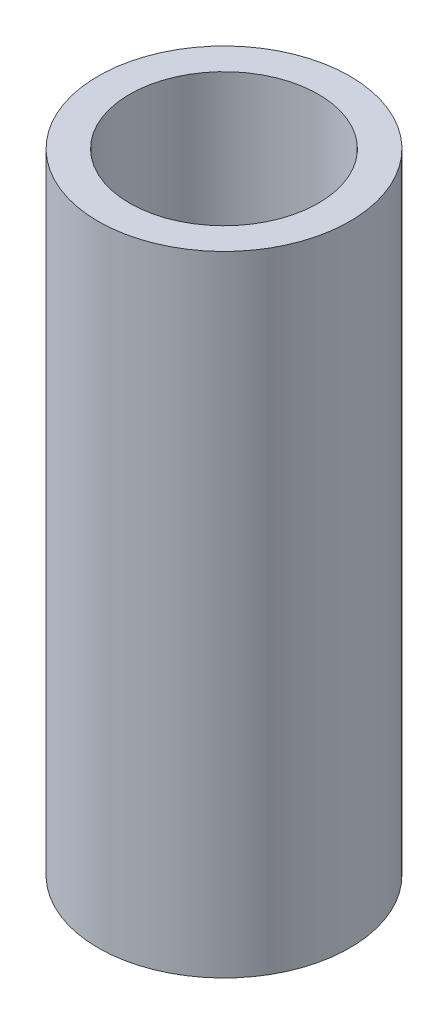
ISO-10303-21;
HEADER;
FILE_DESCRIPTION(('STEP AP214'),'2;1');
FILE_NAME('part.step','',(''),(''),'','','');
FILE_SCHEMA(('AUTOMOTIVE_DESIGN { 1 0 10303 214 1 1 1 1 }'));
ENDSEC;
DATA;
#1=APPLICATION_CONTEXT('core data for automotive mechanical design processes');
#2=APPLICATION_PROTOCOL_DEFINITION('international standard','automotive_design',2000,#1);
#3=PRODUCT_CONTEXT('',#1,'mechanical');
#4=PRODUCT('Part','Part','',(#3));
#5=PRODUCT_RELATED_PRODUCT_CATEGORY('part','',(#4));
#6=PRODUCT_DEFINITION_FORMATION('','',#4);
#7=PRODUCT_DEFINITION_CONTEXT('part definition',#1,'design');
#8=PRODUCT_DEFINITION('design','',#6,#7);
#9=PRODUCT_DEFINITION_SHAPE('','',#8);
#10=(LENGTH_UNIT() NAMED_UNIT(*) SI_UNIT(.MILLI.,.METRE.));
#11=(NAMED_UNIT(*) PLANE_ANGLE_UNIT() SI_UNIT($,.RADIAN.));
#12=(NAMED_UNIT(*) SI_UNIT($,.STERADIAN.) SOLID_ANGLE_UNIT());
#13=UNCERTAINTY_MEASURE_WITH_UNIT(LENGTH_MEASURE(1.E-05),#10,'distance_accuracy_value','');
#14=(GEOMETRIC_REPRESENTATION_CONTEXT(3) GLOBAL_UNCERTAINTY_ASSIGNED_CONTEXT((#13)) GLOBAL_UNIT_ASSIGNED_CONTEXT((#10,
#11,#12)) REPRESENTATION_CONTEXT('',''));
#15=CARTESIAN_POINT('',(0.,0.,0.));
#16=DIRECTION('',(0.,0.,1.));
#17=DIRECTION('',(1.,0.,0.));
#18=AXIS2_PLACEMENT_3D('',#15,#16,#17);
#19=CARTESIAN_POINT('',(0.,10.,0.));
#20=DIRECTION('',(0.,1.,0.));
#21=DIRECTION('',(0.,0.,1.));
#22=AXIS2_PLACEMENT_3D('',#19,#20,#21);
#23=PLANE('',#22);
#24=CARTESIAN_POINT('',(0.,10.,0.));
#25=DIRECTION('',(0.,1.,0.));
#26=DIRECTION('',(0.,0.,1.));
#27=AXIS2_PLACEMENT_3D('',#24,#25,#26);
#28=CIRCLE('',#27,4.);
#29=CARTESIAN_POINT('',(0.,10.,4.));
#30=VERTEX_POINT('',#29);
#31=EDGE_CURVE('E10',#30,#30,#28,.T.);
#32=ORIENTED_EDGE('',*,*,#31,.T.);
#33=EDGE_LOOP('',(#32));
#34=FACE_BOUND('',#33,.T.);
#35=CARTESIAN_POINT('',(0.,10.,0.));
#36=DIRECTION('',(0.,1.,0.));
#37=DIRECTION('',(0.,0.,1.));
#38=AXIS2_PLACEMENT_3D('',#35,#36,#37);
#39=CIRCLE('',#38,3.);
#40=CARTESIAN_POINT('',(0.,10.,3.));
#41=VERTEX_POINT('',#40);
#42=EDGE_CURVE('E58',#41,#41,#39,.T.);
#43=ORIENTED_EDGE('',*,*,#42,.F.);
#44=EDGE_LOOP('',(#43));
#45=FACE_BOUND('',#44,.T.);
#46=ADVANCED_FACE('F45',(#34,#45),#23,.T.);
#47=CARTESIAN_POINT('',(0.,-10.,0.));
#48=DIRECTION('',(0.,1.,0.));
#49=DIRECTION('',(0.,0.,1.));
#50=AXIS2_PLACEMENT_3D('',#47,#48,#49);
#51=PLANE('',#50);
#52=CARTESIAN_POINT('',(0.,-10.,0.));
#53=DIRECTION('',(0.,1.,0.));
#54=DIRECTION('',(0.,0.,1.));
#55=AXIS2_PLACEMENT_3D('',#52,#53,#54);
#56=CIRCLE('',#55,4.);
#57=CARTESIAN_POINT('',(0.,-10.,4.));
#58=VERTEX_POINT('',#57);
#59=EDGE_CURVE('E49',#58,#58,#56,.T.);
#60=ORIENTED_EDGE('',*,*,#59,.F.);
#61=EDGE_LOOP('',(#60));
#62=FACE_BOUND('',#61,.T.);
#63=CARTESIAN_POINT('',(0.,-10.,0.));
#64=DIRECTION('',(0.,1.,0.));
#65=DIRECTION('',(0.,0.,1.));
#66=AXIS2_PLACEMENT_3D('',#63,#64,#65);
#67=CIRCLE('',#66,3.);
#68=CARTESIAN_POINT('',(0.,-10.,3.));
#69=VERTEX_POINT('',#68);
#70=EDGE_CURVE('E60',#69,#69,#67,.T.);
#71=ORIENTED_EDGE('',*,*,#70,.T.);
#72=EDGE_LOOP('',(#71));
#73=FACE_BOUND('',#72,.T.);
#74=ADVANCED_FACE('F72',(#62,#73),#51,.F.);
#75=CARTESIAN_POINT('',(0.,10.,0.));
#76=DIRECTION('',(0.,-1.,0.));
#77=DIRECTION('',(0.,0.,-1.));
#78=AXIS2_PLACEMENT_3D('',#75,#76,#77);
#79=CYLINDRICAL_SURFACE('',#78,4.);
#80=ORIENTED_EDGE('',*,*,#31,.F.);
#81=EDGE_LOOP('',(#80));
#82=FACE_BOUND('',#81,.T.);
#83=ORIENTED_EDGE('',*,*,#59,.T.);
#84=EDGE_LOOP('',(#83));
#85=FACE_BOUND('',#84,.T.);
#86=ADVANCED_FACE('F47',(#82,#85),#79,.T.);
#87=CARTESIAN_POINT('',(0.,10.,0.));
#88=DIRECTION('',(0.,-1.,0.));
#89=DIRECTION('',(0.,0.,-1.));
#90=AXIS2_PLACEMENT_3D('',#87,#88,#89);
#91=CYLINDRICAL_SURFACE('',#90,3.);
#92=ORIENTED_EDGE('',*,*,#42,.T.);
#93=EDGE_LOOP('',(#92));
#94=FACE_BOUND('',#93,.T.);
#95=ORIENTED_EDGE('',*,*,#70,.F.);
#96=EDGE_LOOP('',(#95));
#97=FACE_BOUND('',#96,.T.);
#98=ADVANCED_FACE('F68',(#94,#97),#91,.F.);
#99=CLOSED_SHELL('',(#46,#74,#86,#98));
#100=MANIFOLD_SOLID_BREP('B2',#99);
#101=ADVANCED_BREP_SHAPE_REPRESENTATION('',(#18,#100),#14);
#102=SHAPE_DEFINITION_REPRESENTATION(#9,#101);
ENDSEC;
END-ISO-10303-21;
